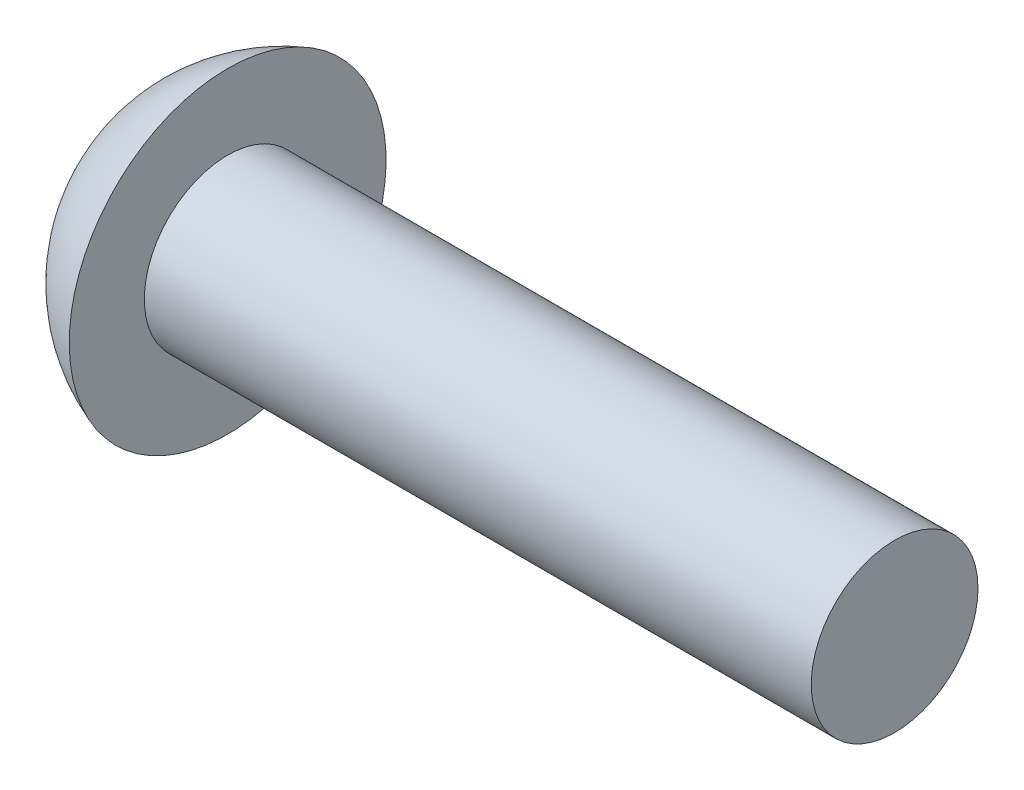
ISO-10303-21;
HEADER;
FILE_DESCRIPTION(('STEP AP214'),'2;1');
FILE_NAME('part.step','',(''),(''),'','','');
FILE_SCHEMA(('AUTOMOTIVE_DESIGN { 1 0 10303 214 1 1 1 1 }'));
ENDSEC;
DATA;
#1=APPLICATION_CONTEXT('core data for automotive mechanical design processes');
#2=APPLICATION_PROTOCOL_DEFINITION('international standard','automotive_design',2000,#1);
#3=PRODUCT_CONTEXT('',#1,'mechanical');
#4=PRODUCT('Part','Part','',(#3));
#5=PRODUCT_RELATED_PRODUCT_CATEGORY('part','',(#4));
#6=PRODUCT_DEFINITION_FORMATION('','',#4);
#7=PRODUCT_DEFINITION_CONTEXT('part definition',#1,'design');
#8=PRODUCT_DEFINITION('design','',#6,#7);
#9=PRODUCT_DEFINITION_SHAPE('','',#8);
#10=(LENGTH_UNIT() NAMED_UNIT(*) SI_UNIT(.MILLI.,.METRE.));
#11=(NAMED_UNIT(*) PLANE_ANGLE_UNIT() SI_UNIT($,.RADIAN.));
#12=(NAMED_UNIT(*) SI_UNIT($,.STERADIAN.) SOLID_ANGLE_UNIT());
#13=UNCERTAINTY_MEASURE_WITH_UNIT(LENGTH_MEASURE(1.E-05),#10,'distance_accuracy_value','');
#14=(GEOMETRIC_REPRESENTATION_CONTEXT(3) GLOBAL_UNCERTAINTY_ASSIGNED_CONTEXT((#13)) GLOBAL_UNIT_ASSIGNED_CONTEXT((#10,
#11,#12)) REPRESENTATION_CONTEXT('',''));
#15=CARTESIAN_POINT('',(0.,0.,0.));
#16=DIRECTION('',(0.,0.,1.));
#17=DIRECTION('',(1.,0.,0.));
#18=AXIS2_PLACEMENT_3D('',#15,#16,#17);
#19=CARTESIAN_POINT('',(0.,0.,0.));
#20=DIRECTION('',(1.,0.,0.));
#21=DIRECTION('',(0.,0.,-1.));
#22=AXIS2_PLACEMENT_3D('',#19,#20,#21);
#23=PLANE('',#22);
#24=CARTESIAN_POINT('',(0.,0.,0.));
#25=DIRECTION('',(-1.,0.,0.));
#26=DIRECTION('',(0.,0.,1.));
#27=AXIS2_PLACEMENT_3D('',#24,#25,#26);
#28=CIRCLE('',#27,1.935);
#29=CARTESIAN_POINT('',(0.,1.935,0.));
#30=VERTEX_POINT('',#29);
#31=EDGE_CURVE('E154',#30,#30,#28,.T.);
#32=ORIENTED_EDGE('',*,*,#31,.T.);
#33=EDGE_LOOP('',(#32));
#34=FACE_BOUND('',#33,.T.);
#35=DIRECTION('',(0.,0.866025403784439,-0.5));
#36=VECTOR('',#35,1.);
#37=CARTESIAN_POINT('',(0.,-1.25,-0.721687836487033));
#38=LINE('',#37,#36);
#39=CARTESIAN_POINT('',(0.,-1.25,-0.721687836487033));
#40=VERTEX_POINT('',#39);
#41=CARTESIAN_POINT('',(0.,0.,-1.44337567297406));
#42=VERTEX_POINT('',#41);
#43=EDGE_CURVE('E70',#40,#42,#38,.T.);
#44=ORIENTED_EDGE('',*,*,#43,.T.);
#45=DIRECTION('',(0.,0.866025403784438,0.5));
#46=VECTOR('',#45,1.);
#47=CARTESIAN_POINT('',(0.,0.,-1.44337567297406));
#48=LINE('',#47,#46);
#49=CARTESIAN_POINT('',(0.,1.25,-0.721687836487032));
#50=VERTEX_POINT('',#49);
#51=EDGE_CURVE('E133',#42,#50,#48,.T.);
#52=ORIENTED_EDGE('',*,*,#51,.T.);
#53=DIRECTION('',(0.,0.,1.));
#54=VECTOR('',#53,1.);
#55=CARTESIAN_POINT('',(0.,1.25,-0.721687836487032));
#56=LINE('',#55,#54);
#57=CARTESIAN_POINT('',(0.,1.25,0.721687836487032));
#58=VERTEX_POINT('',#57);
#59=EDGE_CURVE('E129',#50,#58,#56,.T.);
#60=ORIENTED_EDGE('',*,*,#59,.T.);
#61=DIRECTION('',(0.,-0.866025403784439,0.5));
#62=VECTOR('',#61,1.);
#63=CARTESIAN_POINT('',(0.,1.25,0.721687836487032));
#64=LINE('',#63,#62);
#65=CARTESIAN_POINT('',(0.,0.,1.44337567297406));
#66=VERTEX_POINT('',#65);
#67=EDGE_CURVE('E106',#58,#66,#64,.T.);
#68=ORIENTED_EDGE('',*,*,#67,.T.);
#69=DIRECTION('',(0.,-0.866025403784438,-0.5));
#70=VECTOR('',#69,1.);
#71=CARTESIAN_POINT('',(0.,0.,1.44337567297406));
#72=LINE('',#71,#70);
#73=CARTESIAN_POINT('',(0.,-1.25,0.721687836487032));
#74=VERTEX_POINT('',#73);
#75=EDGE_CURVE('E118',#66,#74,#72,.T.);
#76=ORIENTED_EDGE('',*,*,#75,.T.);
#77=DIRECTION('',(0.,0.,-1.));
#78=VECTOR('',#77,1.);
#79=CARTESIAN_POINT('',(0.,-1.25,0.721687836487032));
#80=LINE('',#79,#78);
#81=EDGE_CURVE('E125',#74,#40,#80,.T.);
#82=ORIENTED_EDGE('',*,*,#81,.T.);
#83=EDGE_LOOP('',(#44,#52,#60,#68,#76,#82));
#84=FACE_BOUND('',#83,.T.);
#85=ADVANCED_FACE('F55',(#34,#84),#23,.F.);
#86=CARTESIAN_POINT('',(2.2,0.,0.));
#87=DIRECTION('',(1.,0.,0.));
#88=DIRECTION('',(0.,0.,-1.));
#89=AXIS2_PLACEMENT_3D('',#86,#87,#88);
#90=PLANE('',#89);
#91=CARTESIAN_POINT('',(2.2,0.,0.));
#92=DIRECTION('',(-1.,0.,0.));
#93=DIRECTION('',(0.,0.,1.));
#94=AXIS2_PLACEMENT_3D('',#91,#92,#93);
#95=CIRCLE('',#94,3.8);
#96=CARTESIAN_POINT('',(2.2,3.8,0.));
#97=VERTEX_POINT('',#96);
#98=EDGE_CURVE('E158',#97,#97,#95,.T.);
#99=ORIENTED_EDGE('',*,*,#98,.F.);
#100=EDGE_LOOP('',(#99));
#101=FACE_BOUND('',#100,.T.);
#102=CARTESIAN_POINT('',(2.2,0.,0.));
#103=DIRECTION('',(1.,0.,0.));
#104=DIRECTION('',(0.,0.,-1.));
#105=AXIS2_PLACEMENT_3D('',#102,#103,#104);
#106=CIRCLE('',#105,2.);
#107=CARTESIAN_POINT('',(2.2,0.,-2.));
#108=VERTEX_POINT('',#107);
#109=EDGE_CURVE('E58',#108,#108,#106,.T.);
#110=ORIENTED_EDGE('',*,*,#109,.F.);
#111=EDGE_LOOP('',(#110));
#112=FACE_BOUND('',#111,.T.);
#113=ADVANCED_FACE('F170',(#101,#112),#90,.T.);
#114=CARTESIAN_POINT('',(18.2,0.,0.));
#115=DIRECTION('',(-1.,0.,0.));
#116=DIRECTION('',(0.,0.,1.));
#117=AXIS2_PLACEMENT_3D('',#114,#115,#116);
#118=CYLINDRICAL_SURFACE('',#117,2.);
#119=CARTESIAN_POINT('',(18.2,0.,0.));
#120=DIRECTION('',(1.,0.,0.));
#121=DIRECTION('',(0.,0.,-1.));
#122=AXIS2_PLACEMENT_3D('',#119,#120,#121);
#123=CIRCLE('',#122,2.);
#124=CARTESIAN_POINT('',(18.2,0.,-2.));
#125=VERTEX_POINT('',#124);
#126=EDGE_CURVE('E11',#125,#125,#123,.T.);
#127=ORIENTED_EDGE('',*,*,#126,.F.);
#128=EDGE_LOOP('',(#127));
#129=FACE_BOUND('',#128,.T.);
#130=ORIENTED_EDGE('',*,*,#109,.T.);
#131=EDGE_LOOP('',(#130));
#132=FACE_BOUND('',#131,.T.);
#133=ADVANCED_FACE('F168',(#129,#132),#118,.T.);
#134=CARTESIAN_POINT('',(18.2,0.,0.));
#135=DIRECTION('',(1.,0.,0.));
#136=DIRECTION('',(0.,0.,-1.));
#137=AXIS2_PLACEMENT_3D('',#134,#135,#136);
#138=PLANE('',#137);
#139=ORIENTED_EDGE('',*,*,#126,.T.);
#140=EDGE_LOOP('',(#139));
#141=FACE_BOUND('',#140,.T.);
#142=ADVANCED_FACE('F176',(#141),#138,.T.);
#143=CARTESIAN_POINT('',(3.53085795454545,0.,0.));
#144=DIRECTION('',(-1.,0.,0.));
#145=DIRECTION('',(0.,1.,0.));
#146=AXIS2_PLACEMENT_3D('',#143,#144,#145);
#147=SPHERICAL_SURFACE('',#146,4.02631132616157);
#148=CARTESIAN_POINT('',(2.2,3.8,0.));
#149=CARTESIAN_POINT('',(2.17100144801153,3.78984402970542,0.));
#150=CARTESIAN_POINT('',(2.14211919541206,3.77935599759403,0.));
#151=CARTESIAN_POINT('',(2.08460232361811,3.7577215785645,0.));
#152=CARTESIAN_POINT('',(2.05596770442362,3.74657519164638,0.));
#153=CARTESIAN_POINT('',(1.99896113406657,3.72362983183029,0.));
#154=CARTESIAN_POINT('',(1.97058918290401,3.71183085893233,0.));
#155=CARTESIAN_POINT('',(1.91412281080011,3.6875865304521,0.));
#156=CARTESIAN_POINT('',(1.88602838985876,3.67514117486983,0.));
#157=CARTESIAN_POINT('',(1.83013180425293,3.64961059830839,0.));
#158=CARTESIAN_POINT('',(1.80232963958845,3.63652537732922,0.));
#159=CARTESIAN_POINT('',(1.74703213692581,3.60972192924812,0.));
#160=CARTESIAN_POINT('',(1.71953679892765,3.59600370214618,0.));
#161=CARTESIAN_POINT('',(1.66486735985046,3.56794143106911,0.));
#162=CARTESIAN_POINT('',(1.63769325877142,3.55359738709397,0.));
#163=CARTESIAN_POINT('',(1.58368053524801,3.52429099998279,0.));
#164=CARTESIAN_POINT('',(1.55684191280364,3.50932865684675,0.));
#165=CARTESIAN_POINT('',(1.50351421249116,3.47879351304458,0.));
#166=CARTESIAN_POINT('',(1.47702513462305,3.46322071237846,0.));
#167=CARTESIAN_POINT('',(1.424410406198,3.4314728151176,0.));
#168=CARTESIAN_POINT('',(1.39828475564107,3.41529771852287,0.));
#169=CARTESIAN_POINT('',(1.34641057410705,3.38235370665615,0.));
#170=CARTESIAN_POINT('',(1.32066204312996,3.36558479138416,0.));
#171=CARTESIAN_POINT('',(1.2695555953777,3.33146193063284,0.));
#172=CARTESIAN_POINT('',(1.24419767860253,3.31410798515353,0.));
#173=CARTESIAN_POINT('',(1.19388574915827,3.27882415906704,0.));
#174=CARTESIAN_POINT('',(1.16893173648919,3.26089427845987,0.));
#175=CARTESIAN_POINT('',(1.11944069347796,3.22446797904081,0.));
#176=CARTESIAN_POINT('',(1.09490366313581,3.20597156022894,0.));
#177=CARTESIAN_POINT('',(1.04625944446182,3.16842187824223,0.));
#178=CARTESIAN_POINT('',(1.02215225612998,3.1493686150674,0.));
#179=CARTESIAN_POINT('',(0.974380355882842,3.11071523003474,0.));
#180=CARTESIAN_POINT('',(0.950715643967543,3.0911151081769,0.));
#181=CARTESIAN_POINT('',(0.90384109906097,3.05137827806292,0.));
#182=CARTESIAN_POINT('',(0.880631266069695,3.03124156980677,0.));
#183=CARTESIAN_POINT('',(0.834678643119837,2.99044212040198,0.));
#184=CARTESIAN_POINT('',(0.811935853161254,2.96977937925334,0.));
#185=CARTESIAN_POINT('',(0.766929235611514,2.92793869325948,0.));
#186=CARTESIAN_POINT('',(0.744665408020356,2.90676074841426,0.));
#187=CARTESIAN_POINT('',(0.700628383519414,2.86390075423776,0.));
#188=CARTESIAN_POINT('',(0.678855186609628,2.84221870490648,0.));
#189=CARTESIAN_POINT('',(0.635810834649362,2.79836186516596,0.));
#190=CARTESIAN_POINT('',(0.614539679598882,2.77618707475671,0.));
#191=CARTESIAN_POINT('',(0.572510559418424,2.73135637451051,0.));
#192=CARTESIAN_POINT('',(0.551752594288447,2.70870046467357,0.));
#193=CARTESIAN_POINT('',(0.510760733051605,2.66291939937317,0.));
#194=CARTESIAN_POINT('',(0.490526836944742,2.63979424390972,0.));
#195=CARTESIAN_POINT('',(0.450593718193615,2.59308680708714,0.));
#196=CARTESIAN_POINT('',(0.430894495549352,2.56950452572801,0.));
#197=CARTESIAN_POINT('',(0.392041047952828,2.5218951964164,0.));
#198=CARTESIAN_POINT('',(0.372886823000566,2.49786814846393,0.));
#199=CARTESIAN_POINT('',(0.335133409356377,2.4493818783853,0.));
#200=CARTESIAN_POINT('',(0.31653422066445,2.42492265625915,0.));
#201=CARTESIAN_POINT('',(0.279900627336809,2.37558485668395,0.));
#202=CARTESIAN_POINT('',(0.261866222701095,2.3507062792349,0.));
#203=CARTESIAN_POINT('',(0.226371648841653,2.30054280790069,0.));
#204=CARTESIAN_POINT('',(0.208911479617924,2.27525791401553,0.));
#205=CARTESIAN_POINT('',(0.174574528630597,2.22429506069232,0.));
#206=CARTESIAN_POINT('',(0.157697746867,2.19861710125426,0.));
#207=CARTESIAN_POINT('',(0.124536410959334,2.14688157726104,0.));
#208=CARTESIAN_POINT('',(0.108251856815265,2.12082401270588,0.));
#209=CARTESIAN_POINT('',(0.0762835288367869,2.06834292461481,0.));
#210=CARTESIAN_POINT('',(0.0605997550023769,2.0419194010789,0.));
#211=CARTESIAN_POINT('',(0.0298411399560801,1.98872028240066,0.));
#212=CARTESIAN_POINT('',(0.0147662987441934,1.96194468725834,0.));
#213=CARTESIAN_POINT('',(0.,1.935,0.));
#214=B_SPLINE_CURVE_WITH_KNOTS('',3,(#148,#149,#150,#151,#152,#153,#154,#155,#156,#157,#158,
#159,#160,#161,#162,#163,#164,#165,#166,#167,#168,#169,#170,#171,#172,#173,#174,#175,#176,#177,
#178,#179,#180,#181,#182,#183,#184,#185,#186,#187,#188,#189,#190,#191,#192,#193,#194,#195,#196,
#197,#198,#199,#200,#201,#202,#203,#204,#205,#206,#207,#208,#209,#210,#211,#212,#213),
.UNSPECIFIED.,.F.,.F.,(4,2,2,2,2,2,2,2,2,2,2,2,2,2,2,2,2,2,2,2,2,2,2,2,2,2,2,2,2,2,2,2,4),(0.,
0.0921746486151418,0.184349297230283,0.276523945845425,0.368698594460567,0.460873243075708,
0.55304789169085,0.645222540305992,0.737397188921133,0.829571837536275,0.921746486151417,
1.01392113476656,1.1060957833817,1.19827043199684,1.29044508061198,1.38261972922712,
1.47479437784227,1.56696902645741,1.65914367507255,1.75131832368769,1.84349297230283,
1.93566762091798,2.02784226953312,2.12001691814826,2.2121915667634,2.30436621537854,
2.39654086399368,2.48871551260882,2.58089016122397,2.67306480983911,2.76523945845425,
2.85741410706939,2.94958875568453),.UNSPECIFIED.);
#215=EDGE_CURVE('BSEAM184',#97,#30,#214,.T.);
#216=ORIENTED_EDGE('',*,*,#98,.T.);
#217=ORIENTED_EDGE('',*,*,#31,.F.);
#218=ORIENTED_EDGE('',*,*,#215,.T.);
#219=ORIENTED_EDGE('',*,*,#215,.F.);
#220=EDGE_LOOP('',(#216,#218,#217,#219));
#221=FACE_BOUND('',#220,.T.);
#222=ADVANCED_FACE('F184',(#221),#147,.T.);
#223=CARTESIAN_POINT('',(1.3,-1.25,-0.721687836487033));
#224=DIRECTION('',(0.,0.5,0.866025403784439));
#225=DIRECTION('',(0.,-0.866025403784439,0.5));
#226=AXIS2_PLACEMENT_3D('',#223,#224,#225);
#227=PLANE('',#226);
#228=ORIENTED_EDGE('',*,*,#43,.F.);
#229=DIRECTION('',(-1.,0.,0.));
#230=VECTOR('',#229,1.);
#231=CARTESIAN_POINT('',(1.3,-1.25,-0.721687836487033));
#232=LINE('',#231,#230);
#233=CARTESIAN_POINT('',(1.3,-1.25,-0.721687836487033));
#234=VERTEX_POINT('',#233);
#235=EDGE_CURVE('E140',#234,#40,#232,.T.);
#236=ORIENTED_EDGE('',*,*,#235,.F.);
#237=DIRECTION('',(0.,0.866025403784439,-0.5));
#238=VECTOR('',#237,1.);
#239=CARTESIAN_POINT('',(1.3,-1.25,-0.721687836487033));
#240=LINE('',#239,#238);
#241=CARTESIAN_POINT('',(1.3,0.,-1.44337567297406));
#242=VERTEX_POINT('',#241);
#243=EDGE_CURVE('E139',#234,#242,#240,.T.);
#244=ORIENTED_EDGE('',*,*,#243,.T.);
#245=DIRECTION('',(-1.,0.,0.));
#246=VECTOR('',#245,1.);
#247=CARTESIAN_POINT('',(1.3,0.,-1.44337567297406));
#248=LINE('',#247,#246);
#249=EDGE_CURVE('E151',#242,#42,#248,.T.);
#250=ORIENTED_EDGE('',*,*,#249,.T.);
#251=EDGE_LOOP('',(#228,#236,#244,#250));
#252=FACE_BOUND('',#251,.T.);
#253=ADVANCED_FACE('F188',(#252),#227,.T.);
#254=CARTESIAN_POINT('',(1.3,0.,-1.44337567297406));
#255=DIRECTION('',(0.,-0.5,0.866025403784438));
#256=DIRECTION('',(0.,-0.866025403784438,-0.5));
#257=AXIS2_PLACEMENT_3D('',#254,#255,#256);
#258=PLANE('',#257);
#259=ORIENTED_EDGE('',*,*,#51,.F.);
#260=ORIENTED_EDGE('',*,*,#249,.F.);
#261=DIRECTION('',(0.,0.866025403784438,0.5));
#262=VECTOR('',#261,1.);
#263=CARTESIAN_POINT('',(1.3,0.,-1.44337567297406));
#264=LINE('',#263,#262);
#265=CARTESIAN_POINT('',(1.3,1.25,-0.721687836487032));
#266=VERTEX_POINT('',#265);
#267=EDGE_CURVE('E265',#242,#266,#264,.T.);
#268=ORIENTED_EDGE('',*,*,#267,.T.);
#269=DIRECTION('',(-1.,0.,0.));
#270=VECTOR('',#269,1.);
#271=CARTESIAN_POINT('',(1.3,1.25,-0.721687836487032));
#272=LINE('',#271,#270);
#273=EDGE_CURVE('E148',#266,#50,#272,.T.);
#274=ORIENTED_EDGE('',*,*,#273,.T.);
#275=EDGE_LOOP('',(#259,#260,#268,#274));
#276=FACE_BOUND('',#275,.T.);
#277=ADVANCED_FACE('F191',(#276),#258,.T.);
#278=CARTESIAN_POINT('',(1.3,1.25,-0.721687836487032));
#279=DIRECTION('',(0.,-1.,0.));
#280=DIRECTION('',(0.,0.,-1.));
#281=AXIS2_PLACEMENT_3D('',#278,#279,#280);
#282=PLANE('',#281);
#283=ORIENTED_EDGE('',*,*,#59,.F.);
#284=ORIENTED_EDGE('',*,*,#273,.F.);
#285=DIRECTION('',(0.,0.,1.));
#286=VECTOR('',#285,1.);
#287=CARTESIAN_POINT('',(1.3,1.25,-0.721687836487032));
#288=LINE('',#287,#286);
#289=CARTESIAN_POINT('',(1.3,1.25,0.721687836487032));
#290=VERTEX_POINT('',#289);
#291=EDGE_CURVE('E79',#266,#290,#288,.T.);
#292=ORIENTED_EDGE('',*,*,#291,.T.);
#293=DIRECTION('',(-1.,0.,0.));
#294=VECTOR('',#293,1.);
#295=CARTESIAN_POINT('',(1.3,1.25,0.721687836487032));
#296=LINE('',#295,#294);
#297=EDGE_CURVE('E114',#290,#58,#296,.T.);
#298=ORIENTED_EDGE('',*,*,#297,.T.);
#299=EDGE_LOOP('',(#283,#284,#292,#298));
#300=FACE_BOUND('',#299,.T.);
#301=ADVANCED_FACE('F194',(#300),#282,.T.);
#302=CARTESIAN_POINT('',(1.3,1.25,0.721687836487032));
#303=DIRECTION('',(0.,-0.5,-0.866025403784439));
#304=DIRECTION('',(0.,0.866025403784439,-0.5));
#305=AXIS2_PLACEMENT_3D('',#302,#303,#304);
#306=PLANE('',#305);
#307=ORIENTED_EDGE('',*,*,#67,.F.);
#308=ORIENTED_EDGE('',*,*,#297,.F.);
#309=DIRECTION('',(0.,-0.866025403784439,0.5));
#310=VECTOR('',#309,1.);
#311=CARTESIAN_POINT('',(1.3,1.25,0.721687836487032));
#312=LINE('',#311,#310);
#313=CARTESIAN_POINT('',(1.3,0.,1.44337567297406));
#314=VERTEX_POINT('',#313);
#315=EDGE_CURVE('E110',#290,#314,#312,.T.);
#316=ORIENTED_EDGE('',*,*,#315,.T.);
#317=DIRECTION('',(-1.,0.,0.));
#318=VECTOR('',#317,1.);
#319=CARTESIAN_POINT('',(1.3,0.,1.44337567297406));
#320=LINE('',#319,#318);
#321=EDGE_CURVE('E101',#314,#66,#320,.T.);
#322=ORIENTED_EDGE('',*,*,#321,.T.);
#323=EDGE_LOOP('',(#307,#308,#316,#322));
#324=FACE_BOUND('',#323,.T.);
#325=ADVANCED_FACE('F103',(#324),#306,.T.);
#326=CARTESIAN_POINT('',(1.3,0.,1.44337567297406));
#327=DIRECTION('',(0.,0.5,-0.866025403784438));
#328=DIRECTION('',(0.,0.866025403784439,0.5));
#329=AXIS2_PLACEMENT_3D('',#326,#327,#328);
#330=PLANE('',#329);
#331=ORIENTED_EDGE('',*,*,#75,.F.);
#332=ORIENTED_EDGE('',*,*,#321,.F.);
#333=DIRECTION('',(0.,-0.866025403784438,-0.5));
#334=VECTOR('',#333,1.);
#335=CARTESIAN_POINT('',(1.3,0.,1.44337567297406));
#336=LINE('',#335,#334);
#337=CARTESIAN_POINT('',(1.3,-1.25,0.721687836487032));
#338=VERTEX_POINT('',#337);
#339=EDGE_CURVE('E234',#314,#338,#336,.T.);
#340=ORIENTED_EDGE('',*,*,#339,.T.);
#341=DIRECTION('',(-1.,0.,0.));
#342=VECTOR('',#341,1.);
#343=CARTESIAN_POINT('',(1.3,-1.25,0.721687836487032));
#344=LINE('',#343,#342);
#345=EDGE_CURVE('E115',#338,#74,#344,.T.);
#346=ORIENTED_EDGE('',*,*,#345,.T.);
#347=EDGE_LOOP('',(#331,#332,#340,#346));
#348=FACE_BOUND('',#347,.T.);
#349=ADVANCED_FACE('F119',(#348),#330,.T.);
#350=CARTESIAN_POINT('',(1.3,-1.25,0.721687836487032));
#351=DIRECTION('',(0.,1.,0.));
#352=DIRECTION('',(0.,0.,1.));
#353=AXIS2_PLACEMENT_3D('',#350,#351,#352);
#354=PLANE('',#353);
#355=ORIENTED_EDGE('',*,*,#81,.F.);
#356=ORIENTED_EDGE('',*,*,#345,.F.);
#357=DIRECTION('',(0.,0.,-1.));
#358=VECTOR('',#357,1.);
#359=CARTESIAN_POINT('',(1.3,-1.25,0.721687836487032));
#360=LINE('',#359,#358);
#361=EDGE_CURVE('E143',#338,#234,#360,.T.);
#362=ORIENTED_EDGE('',*,*,#361,.T.);
#363=ORIENTED_EDGE('',*,*,#235,.T.);
#364=EDGE_LOOP('',(#355,#356,#362,#363));
#365=FACE_BOUND('',#364,.T.);
#366=ADVANCED_FACE('F203',(#365),#354,.T.);
#367=CARTESIAN_POINT('',(1.3,0.,1.44337567297406));
#368=DIRECTION('',(0.86602540378444,-0.249999999999999,0.433012701892218));
#369=DIRECTION('',(0.447213595499956,0.,-0.894427190999917));
#370=AXIS2_PLACEMENT_3D('',#367,#368,#369);
#371=PLANE('',#370);
#372=ORIENTED_EDGE('',*,*,#339,.F.);
#373=DIRECTION('',(-0.447213595499956,0.,0.894427190999917));
#374=VECTOR('',#373,1.);
#375=CARTESIAN_POINT('',(1.3,0.,1.44337567297406));
#376=LINE('',#375,#374);
#377=CARTESIAN_POINT('',(2.02168783648703,0.,0.));
#378=VERTEX_POINT('',#377);
#379=EDGE_CURVE('E236',#378,#314,#376,.T.);
#380=ORIENTED_EDGE('',*,*,#379,.F.);
#381=DIRECTION('',(-0.447213595499956,-0.774596669241484,0.447213595499958));
#382=VECTOR('',#381,1.);
#383=CARTESIAN_POINT('',(1.3,-1.25,0.721687836487032));
#384=LINE('',#383,#382);
#385=EDGE_CURVE('E239',#378,#338,#384,.T.);
#386=ORIENTED_EDGE('',*,*,#385,.T.);
#387=EDGE_LOOP('',(#372,#380,#386));
#388=FACE_BOUND('',#387,.T.);
#389=ADVANCED_FACE('F206',(#388),#371,.F.);
#390=CARTESIAN_POINT('',(1.3,-1.25,0.721687836487032));
#391=DIRECTION('',(0.86602540378444,-0.499999999999998,0.));
#392=DIRECTION('',(0.499999999999998,0.86602540378444,0.));
#393=AXIS2_PLACEMENT_3D('',#390,#391,#392);
#394=PLANE('',#393);
#395=ORIENTED_EDGE('',*,*,#361,.F.);
#396=ORIENTED_EDGE('',*,*,#385,.F.);
#397=DIRECTION('',(-0.447213595499956,-0.774596669241484,-0.447213595499958));
#398=VECTOR('',#397,1.);
#399=CARTESIAN_POINT('',(1.3,-1.25,-0.721687836487033));
#400=LINE('',#399,#398);
#401=EDGE_CURVE('E270',#378,#234,#400,.T.);
#402=ORIENTED_EDGE('',*,*,#401,.T.);
#403=EDGE_LOOP('',(#395,#396,#402));
#404=FACE_BOUND('',#403,.T.);
#405=ADVANCED_FACE('F208',(#404),#394,.F.);
#406=CARTESIAN_POINT('',(1.3,-1.25,-0.721687836487033));
#407=DIRECTION('',(0.86602540378444,-0.249999999999999,-0.433012701892218));
#408=DIRECTION('',(-0.447213595499956,0.,-0.894427190999917));
#409=AXIS2_PLACEMENT_3D('',#406,#407,#408);
#410=PLANE('',#409);
#411=ORIENTED_EDGE('',*,*,#243,.F.);
#412=ORIENTED_EDGE('',*,*,#401,.F.);
#413=DIRECTION('',(-0.447213595499956,0.,-0.894427190999917));
#414=VECTOR('',#413,1.);
#415=CARTESIAN_POINT('',(1.3,0.,-1.44337567297406));
#416=LINE('',#415,#414);
#417=EDGE_CURVE('E279',#378,#242,#416,.T.);
#418=ORIENTED_EDGE('',*,*,#417,.T.);
#419=EDGE_LOOP('',(#411,#412,#418));
#420=FACE_BOUND('',#419,.T.);
#421=ADVANCED_FACE('F211',(#420),#410,.F.);
#422=CARTESIAN_POINT('',(1.3,0.,-1.44337567297406));
#423=DIRECTION('',(0.86602540378444,0.249999999999999,-0.433012701892217));
#424=DIRECTION('',(-0.447213595499956,0.,-0.894427190999917));
#425=AXIS2_PLACEMENT_3D('',#422,#423,#424);
#426=PLANE('',#425);
#427=ORIENTED_EDGE('',*,*,#267,.F.);
#428=ORIENTED_EDGE('',*,*,#417,.F.);
#429=DIRECTION('',(-0.447213595499956,0.774596669241484,-0.447213595499958));
#430=VECTOR('',#429,1.);
#431=CARTESIAN_POINT('',(1.3,1.25,-0.721687836487032));
#432=LINE('',#431,#430);
#433=EDGE_CURVE('E282',#378,#266,#432,.T.);
#434=ORIENTED_EDGE('',*,*,#433,.T.);
#435=EDGE_LOOP('',(#427,#428,#434));
#436=FACE_BOUND('',#435,.T.);
#437=ADVANCED_FACE('F215',(#436),#426,.F.);
#438=CARTESIAN_POINT('',(1.3,1.25,-0.721687836487032));
#439=DIRECTION('',(0.86602540378444,0.499999999999998,0.));
#440=DIRECTION('',(-0.499999999999998,0.86602540378444,0.));
#441=AXIS2_PLACEMENT_3D('',#438,#439,#440);
#442=PLANE('',#441);
#443=ORIENTED_EDGE('',*,*,#291,.F.);
#444=ORIENTED_EDGE('',*,*,#433,.F.);
#445=DIRECTION('',(-0.447213595499956,0.774596669241484,0.447213595499958));
#446=VECTOR('',#445,1.);
#447=CARTESIAN_POINT('',(1.3,1.25,0.721687836487032));
#448=LINE('',#447,#446);
#449=EDGE_CURVE('E275',#378,#290,#448,.T.);
#450=ORIENTED_EDGE('',*,*,#449,.T.);
#451=EDGE_LOOP('',(#443,#444,#450));
#452=FACE_BOUND('',#451,.T.);
#453=ADVANCED_FACE('F219',(#452),#442,.F.);
#454=CARTESIAN_POINT('',(1.3,1.25,0.721687836487032));
#455=DIRECTION('',(0.86602540378444,0.249999999999999,0.433012701892218));
#456=DIRECTION('',(0.447213595499956,0.,-0.894427190999917));
#457=AXIS2_PLACEMENT_3D('',#454,#455,#456);
#458=PLANE('',#457);
#459=ORIENTED_EDGE('',*,*,#315,.F.);
#460=ORIENTED_EDGE('',*,*,#449,.F.);
#461=ORIENTED_EDGE('',*,*,#379,.T.);
#462=EDGE_LOOP('',(#459,#460,#461));
#463=FACE_BOUND('',#462,.T.);
#464=ADVANCED_FACE('F223',(#463),#458,.F.);
#465=CLOSED_SHELL('',(#85,#113,#133,#142,#222,#253,#277,#301,#325,#349,#366,#389,#405,#421,#437,
#453,#464));
#466=MANIFOLD_SOLID_BREP('B2',#465);
#467=ADVANCED_BREP_SHAPE_REPRESENTATION('',(#18,#466),#14);
#468=SHAPE_DEFINITION_REPRESENTATION(#9,#467);
ENDSEC;
END-ISO-10303-21;
